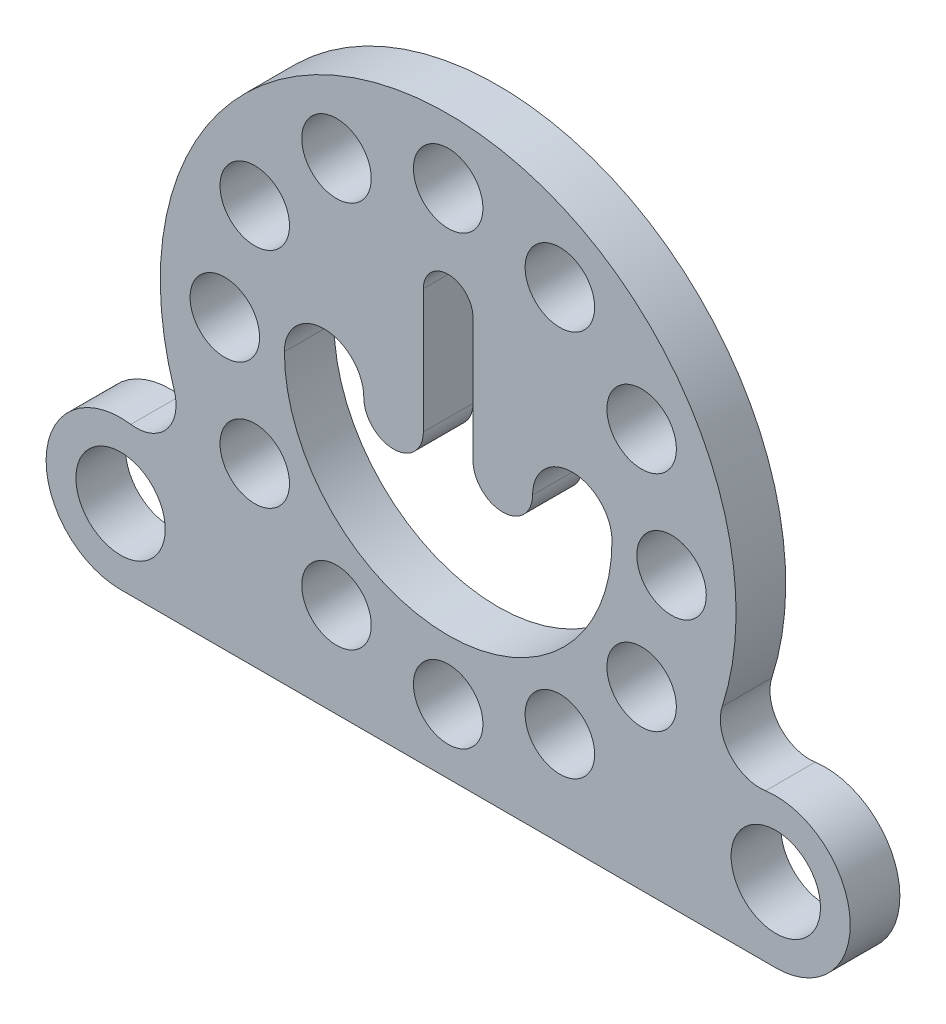
ISO-10303-21;
HEADER;
FILE_DESCRIPTION(('STEP AP214'),'2;1');
FILE_NAME('part.step','',(''),(''),'','','');
FILE_SCHEMA(('AUTOMOTIVE_DESIGN { 1 0 10303 214 1 1 1 1 }'));
ENDSEC;
DATA;
#1=APPLICATION_CONTEXT('core data for automotive mechanical design processes');
#2=APPLICATION_PROTOCOL_DEFINITION('international standard','automotive_design',2000,#1);
#3=PRODUCT_CONTEXT('',#1,'mechanical');
#4=PRODUCT('Part','Part','',(#3));
#5=PRODUCT_RELATED_PRODUCT_CATEGORY('part','',(#4));
#6=PRODUCT_DEFINITION_FORMATION('','',#4);
#7=PRODUCT_DEFINITION_CONTEXT('part definition',#1,'design');
#8=PRODUCT_DEFINITION('design','',#6,#7);
#9=PRODUCT_DEFINITION_SHAPE('','',#8);
#10=(LENGTH_UNIT() NAMED_UNIT(*) SI_UNIT(.MILLI.,.METRE.));
#11=(NAMED_UNIT(*) PLANE_ANGLE_UNIT() SI_UNIT($,.RADIAN.));
#12=(NAMED_UNIT(*) SI_UNIT($,.STERADIAN.) SOLID_ANGLE_UNIT());
#13=UNCERTAINTY_MEASURE_WITH_UNIT(LENGTH_MEASURE(1.E-05),#10,'distance_accuracy_value','');
#14=(GEOMETRIC_REPRESENTATION_CONTEXT(3) GLOBAL_UNCERTAINTY_ASSIGNED_CONTEXT((#13)) GLOBAL_UNIT_ASSIGNED_CONTEXT((#10,
#11,#12)) REPRESENTATION_CONTEXT('',''));
#15=CARTESIAN_POINT('',(0.,0.,0.));
#16=DIRECTION('',(0.,0.,1.));
#17=DIRECTION('',(1.,0.,0.));
#18=AXIS2_PLACEMENT_3D('',#15,#16,#17);
#19=CARTESIAN_POINT('',(5.,0.,10.));
#20=DIRECTION('',(1.,0.,0.));
#21=DIRECTION('',(0.,1.,0.));
#22=AXIS2_PLACEMENT_3D('',#19,#20,#21);
#23=PLANE('',#22);
#24=DIRECTION('',(0.,-1.,0.));
#25=VECTOR('',#24,1.);
#26=CARTESIAN_POINT('',(5.,0.,0.));
#27=LINE('',#26,#25);
#28=CARTESIAN_POINT('',(5.,25.,0.));
#29=VERTEX_POINT('',#28);
#30=CARTESIAN_POINT('',(5.,0.,0.));
#31=VERTEX_POINT('',#30);
#32=EDGE_CURVE('E235',#29,#31,#27,.T.);
#33=ORIENTED_EDGE('',*,*,#32,.T.);
#34=DIRECTION('',(0.,0.,-1.));
#35=VECTOR('',#34,1.);
#36=CARTESIAN_POINT('',(5.,0.,10.));
#37=LINE('',#36,#35);
#38=CARTESIAN_POINT('',(5.,0.,10.));
#39=VERTEX_POINT('',#38);
#40=EDGE_CURVE('E11',#39,#31,#37,.T.);
#41=ORIENTED_EDGE('',*,*,#40,.F.);
#42=DIRECTION('',(0.,-1.,0.));
#43=VECTOR('',#42,1.);
#44=CARTESIAN_POINT('',(5.,0.,10.));
#45=LINE('',#44,#43);
#46=CARTESIAN_POINT('',(5.,25.,10.));
#47=VERTEX_POINT('',#46);
#48=EDGE_CURVE('E379',#47,#39,#45,.T.);
#49=ORIENTED_EDGE('',*,*,#48,.F.);
#50=DIRECTION('',(0.,0.,-1.));
#51=VECTOR('',#50,1.);
#52=CARTESIAN_POINT('',(5.,25.,10.));
#53=LINE('',#52,#51);
#54=EDGE_CURVE('E55',#47,#29,#53,.T.);
#55=ORIENTED_EDGE('',*,*,#54,.T.);
#56=EDGE_LOOP('',(#33,#41,#49,#55));
#57=FACE_BOUND('',#56,.T.);
#58=ADVANCED_FACE('F36',(#57),#23,.F.);
#59=CARTESIAN_POINT('',(11.,0.,10.));
#60=DIRECTION('',(0.,0.,-1.));
#61=DIRECTION('',(-1.,0.,0.));
#62=AXIS2_PLACEMENT_3D('',#59,#60,#61);
#63=CYLINDRICAL_SURFACE('',#62,6.);
#64=CARTESIAN_POINT('',(11.,0.,0.));
#65=DIRECTION('',(0.,0.,1.));
#66=DIRECTION('',(1.,0.,0.));
#67=AXIS2_PLACEMENT_3D('',#64,#65,#66);
#68=CIRCLE('',#67,6.);
#69=CARTESIAN_POINT('',(17.,0.,0.));
#70=VERTEX_POINT('',#69);
#71=EDGE_CURVE('E237',#31,#70,#68,.T.);
#72=ORIENTED_EDGE('',*,*,#71,.T.);
#73=DIRECTION('',(0.,0.,-1.));
#74=VECTOR('',#73,1.);
#75=CARTESIAN_POINT('',(17.,0.,10.));
#76=LINE('',#75,#74);
#77=CARTESIAN_POINT('',(17.,0.,10.));
#78=VERTEX_POINT('',#77);
#79=EDGE_CURVE('E46',#78,#70,#76,.T.);
#80=ORIENTED_EDGE('',*,*,#79,.F.);
#81=CARTESIAN_POINT('',(11.,0.,10.));
#82=DIRECTION('',(0.,0.,1.));
#83=DIRECTION('',(1.,0.,0.));
#84=AXIS2_PLACEMENT_3D('',#81,#82,#83);
#85=CIRCLE('',#84,6.);
#86=EDGE_CURVE('E375',#39,#78,#85,.T.);
#87=ORIENTED_EDGE('',*,*,#86,.F.);
#88=ORIENTED_EDGE('',*,*,#40,.T.);
#89=EDGE_LOOP('',(#72,#80,#87,#88));
#90=FACE_BOUND('',#89,.T.);
#91=ADVANCED_FACE('F318',(#90),#63,.T.);
#92=CARTESIAN_POINT('',(25.,0.,10.));
#93=DIRECTION('',(0.,0.,-1.));
#94=DIRECTION('',(-1.,0.,0.));
#95=AXIS2_PLACEMENT_3D('',#92,#93,#94);
#96=CYLINDRICAL_SURFACE('',#95,8.);
#97=CARTESIAN_POINT('',(25.,0.,0.));
#98=DIRECTION('',(0.,0.,1.));
#99=DIRECTION('',(1.,0.,0.));
#100=AXIS2_PLACEMENT_3D('',#97,#98,#99);
#101=CIRCLE('',#100,8.);
#102=CARTESIAN_POINT('',(33.,0.,0.));
#103=VERTEX_POINT('',#102);
#104=EDGE_CURVE('E240',#103,#70,#101,.T.);
#105=ORIENTED_EDGE('',*,*,#104,.F.);
#106=DIRECTION('',(0.,0.,-1.));
#107=VECTOR('',#106,1.);
#108=CARTESIAN_POINT('',(33.,0.,10.));
#109=LINE('',#108,#107);
#110=CARTESIAN_POINT('',(33.,0.,10.));
#111=VERTEX_POINT('',#110);
#112=EDGE_CURVE('E267',#111,#103,#109,.T.);
#113=ORIENTED_EDGE('',*,*,#112,.F.);
#114=CARTESIAN_POINT('',(25.,0.,10.));
#115=DIRECTION('',(0.,0.,1.));
#116=DIRECTION('',(1.,0.,0.));
#117=AXIS2_PLACEMENT_3D('',#114,#115,#116);
#118=CIRCLE('',#117,8.);
#119=EDGE_CURVE('E373',#111,#78,#118,.T.);
#120=ORIENTED_EDGE('',*,*,#119,.T.);
#121=ORIENTED_EDGE('',*,*,#79,.T.);
#122=EDGE_LOOP('',(#105,#113,#120,#121));
#123=FACE_BOUND('',#122,.T.);
#124=ADVANCED_FACE('F323',(#123),#96,.F.);
#125=CARTESIAN_POINT('',(0.,0.,10.));
#126=DIRECTION('',(0.,0.,-1.));
#127=DIRECTION('',(-1.,0.,0.));
#128=AXIS2_PLACEMENT_3D('',#125,#126,#127);
#129=CYLINDRICAL_SURFACE('',#128,33.);
#130=CARTESIAN_POINT('',(0.,0.,0.));
#131=DIRECTION('',(0.,0.,1.));
#132=DIRECTION('',(1.,0.,0.));
#133=AXIS2_PLACEMENT_3D('',#130,#131,#132);
#134=CIRCLE('',#133,33.);
#135=CARTESIAN_POINT('',(-33.,0.,0.));
#136=VERTEX_POINT('',#135);
#137=EDGE_CURVE('E243',#136,#103,#134,.T.);
#138=ORIENTED_EDGE('',*,*,#137,.F.);
#139=DIRECTION('',(0.,0.,-1.));
#140=VECTOR('',#139,1.);
#141=CARTESIAN_POINT('',(-33.,0.,10.));
#142=LINE('',#141,#140);
#143=CARTESIAN_POINT('',(-33.,0.,10.));
#144=VERTEX_POINT('',#143);
#145=EDGE_CURVE('E265',#144,#136,#142,.T.);
#146=ORIENTED_EDGE('',*,*,#145,.F.);
#147=CARTESIAN_POINT('',(0.,0.,10.));
#148=DIRECTION('',(0.,0.,1.));
#149=DIRECTION('',(1.,0.,0.));
#150=AXIS2_PLACEMENT_3D('',#147,#148,#149);
#151=CIRCLE('',#150,33.);
#152=EDGE_CURVE('E372',#144,#111,#151,.T.);
#153=ORIENTED_EDGE('',*,*,#152,.T.);
#154=ORIENTED_EDGE('',*,*,#112,.T.);
#155=EDGE_LOOP('',(#138,#146,#153,#154));
#156=FACE_BOUND('',#155,.T.);
#157=ADVANCED_FACE('F356',(#156),#129,.F.);
#158=CARTESIAN_POINT('',(-25.,1.00710903625967E-13,10.));
#159=DIRECTION('',(0.,0.,-1.));
#160=DIRECTION('',(-1.,0.,0.));
#161=AXIS2_PLACEMENT_3D('',#158,#159,#160);
#162=CYLINDRICAL_SURFACE('',#161,8.);
#163=CARTESIAN_POINT('',(-25.,1.00710903625967E-13,0.));
#164=DIRECTION('',(0.,0.,1.));
#165=DIRECTION('',(1.,0.,0.));
#166=AXIS2_PLACEMENT_3D('',#163,#164,#165);
#167=CIRCLE('',#166,8.);
#168=CARTESIAN_POINT('',(-17.,1.00710903625967E-13,0.));
#169=VERTEX_POINT('',#168);
#170=EDGE_CURVE('E246',#169,#136,#167,.T.);
#171=ORIENTED_EDGE('',*,*,#170,.F.);
#172=DIRECTION('',(0.,0.,-1.));
#173=VECTOR('',#172,1.);
#174=CARTESIAN_POINT('',(-17.,1.00710903625967E-13,10.));
#175=LINE('',#174,#173);
#176=CARTESIAN_POINT('',(-17.,1.00710903625967E-13,10.));
#177=VERTEX_POINT('',#176);
#178=EDGE_CURVE('E167',#177,#169,#175,.T.);
#179=ORIENTED_EDGE('',*,*,#178,.F.);
#180=CARTESIAN_POINT('',(-25.,1.00710903625967E-13,10.));
#181=DIRECTION('',(0.,0.,1.));
#182=DIRECTION('',(1.,0.,0.));
#183=AXIS2_PLACEMENT_3D('',#180,#181,#182);
#184=CIRCLE('',#183,8.);
#185=EDGE_CURVE('E157',#177,#144,#184,.T.);
#186=ORIENTED_EDGE('',*,*,#185,.T.);
#187=ORIENTED_EDGE('',*,*,#145,.T.);
#188=EDGE_LOOP('',(#171,#179,#186,#187));
#189=FACE_BOUND('',#188,.T.);
#190=ADVANCED_FACE('F353',(#189),#162,.F.);
#191=CARTESIAN_POINT('',(-11.,0.,10.));
#192=DIRECTION('',(0.,0.,-1.));
#193=DIRECTION('',(-1.,0.,0.));
#194=AXIS2_PLACEMENT_3D('',#191,#192,#193);
#195=CYLINDRICAL_SURFACE('',#194,6.);
#196=CARTESIAN_POINT('',(-11.,0.,0.));
#197=DIRECTION('',(0.,0.,1.));
#198=DIRECTION('',(1.,0.,0.));
#199=AXIS2_PLACEMENT_3D('',#196,#197,#198);
#200=CIRCLE('',#199,6.);
#201=CARTESIAN_POINT('',(-5.,0.,0.));
#202=VERTEX_POINT('',#201);
#203=EDGE_CURVE('E164',#169,#202,#200,.T.);
#204=ORIENTED_EDGE('',*,*,#203,.T.);
#205=DIRECTION('',(0.,0.,-1.));
#206=VECTOR('',#205,1.);
#207=CARTESIAN_POINT('',(-5.,0.,10.));
#208=LINE('',#207,#206);
#209=CARTESIAN_POINT('',(-5.,0.,10.));
#210=VERTEX_POINT('',#209);
#211=EDGE_CURVE('E161',#210,#202,#208,.T.);
#212=ORIENTED_EDGE('',*,*,#211,.F.);
#213=CARTESIAN_POINT('',(-11.,0.,10.));
#214=DIRECTION('',(0.,0.,1.));
#215=DIRECTION('',(1.,0.,0.));
#216=AXIS2_PLACEMENT_3D('',#213,#214,#215);
#217=CIRCLE('',#216,6.);
#218=EDGE_CURVE('E147',#177,#210,#217,.T.);
#219=ORIENTED_EDGE('',*,*,#218,.F.);
#220=ORIENTED_EDGE('',*,*,#178,.T.);
#221=EDGE_LOOP('',(#204,#212,#219,#220));
#222=FACE_BOUND('',#221,.T.);
#223=ADVANCED_FACE('F162',(#222),#195,.T.);
#224=CARTESIAN_POINT('',(-5.,0.,10.));
#225=DIRECTION('',(1.,0.,0.));
#226=DIRECTION('',(0.,1.,0.));
#227=AXIS2_PLACEMENT_3D('',#224,#225,#226);
#228=PLANE('',#227);
#229=DIRECTION('',(0.,-1.,0.));
#230=VECTOR('',#229,1.);
#231=CARTESIAN_POINT('',(-5.,0.,0.));
#232=LINE('',#231,#230);
#233=CARTESIAN_POINT('',(-5.,25.,0.));
#234=VERTEX_POINT('',#233);
#235=EDGE_CURVE('E250',#234,#202,#232,.T.);
#236=ORIENTED_EDGE('',*,*,#235,.F.);
#237=DIRECTION('',(0.,0.,-1.));
#238=VECTOR('',#237,1.);
#239=CARTESIAN_POINT('',(-5.,25.,10.));
#240=LINE('',#239,#238);
#241=CARTESIAN_POINT('',(-5.,25.,10.));
#242=VERTEX_POINT('',#241);
#243=EDGE_CURVE('E99',#242,#234,#240,.T.);
#244=ORIENTED_EDGE('',*,*,#243,.F.);
#245=DIRECTION('',(0.,-1.,0.));
#246=VECTOR('',#245,1.);
#247=CARTESIAN_POINT('',(-5.,0.,10.));
#248=LINE('',#247,#246);
#249=EDGE_CURVE('E154',#242,#210,#248,.T.);
#250=ORIENTED_EDGE('',*,*,#249,.T.);
#251=ORIENTED_EDGE('',*,*,#211,.T.);
#252=EDGE_LOOP('',(#236,#244,#250,#251));
#253=FACE_BOUND('',#252,.T.);
#254=ADVANCED_FACE('F169',(#253),#228,.T.);
#255=CARTESIAN_POINT('',(0.,0.,10.));
#256=DIRECTION('',(0.,0.,-1.));
#257=DIRECTION('',(-1.,0.,0.));
#258=AXIS2_PLACEMENT_3D('',#255,#256,#257);
#259=CYLINDRICAL_SURFACE('',#258,58.);
#260=CARTESIAN_POINT('',(0.,0.,0.));
#261=DIRECTION('',(0.,0.,1.));
#262=DIRECTION('',(1.,0.,0.));
#263=AXIS2_PLACEMENT_3D('',#260,#261,#262);
#264=CIRCLE('',#263,58.);
#265=CARTESIAN_POINT('',(55.2110417489052,-17.7690987109827,0.));
#266=VERTEX_POINT('',#265);
#267=CARTESIAN_POINT('',(-55.2110417489052,-17.7690987109828,0.));
#268=VERTEX_POINT('',#267);
#269=EDGE_CURVE('E218',#266,#268,#264,.T.);
#270=ORIENTED_EDGE('',*,*,#269,.T.);
#271=DIRECTION('',(0.,0.,-1.));
#272=VECTOR('',#271,1.);
#273=CARTESIAN_POINT('',(-55.2110417489052,-17.7690987109828,10.));
#274=LINE('',#273,#272);
#275=CARTESIAN_POINT('',(-55.2110417489052,-17.7690987109828,10.));
#276=VERTEX_POINT('',#275);
#277=EDGE_CURVE('E40',#276,#268,#274,.T.);
#278=ORIENTED_EDGE('',*,*,#277,.F.);
#279=CARTESIAN_POINT('',(0.,0.,10.));
#280=DIRECTION('',(0.,0.,1.));
#281=DIRECTION('',(1.,0.,0.));
#282=AXIS2_PLACEMENT_3D('',#279,#280,#281);
#283=CIRCLE('',#282,58.);
#284=CARTESIAN_POINT('',(55.2110417489052,-17.7690987109827,10.));
#285=VERTEX_POINT('',#284);
#286=EDGE_CURVE('E388',#285,#276,#283,.T.);
#287=ORIENTED_EDGE('',*,*,#286,.F.);
#288=DIRECTION('',(0.,0.,-1.));
#289=VECTOR('',#288,1.);
#290=CARTESIAN_POINT('',(55.2110417489052,-17.7690987109827,10.));
#291=LINE('',#290,#289);
#292=EDGE_CURVE('E181',#285,#266,#291,.T.);
#293=ORIENTED_EDGE('',*,*,#292,.T.);
#294=EDGE_LOOP('',(#270,#278,#287,#293));
#295=FACE_BOUND('',#294,.T.);
#296=ADVANCED_FACE('F286',(#295),#259,.T.);
#297=CARTESIAN_POINT('',(-62.8263578522024,-20.2200088780149,10.));
#298=DIRECTION('',(0.,0.,-1.));
#299=DIRECTION('',(-1.,0.,0.));
#300=AXIS2_PLACEMENT_3D('',#297,#298,#299);
#301=CYLINDRICAL_SURFACE('',#300,7.99999999999999);
#302=CARTESIAN_POINT('',(-62.8263578522024,-20.2200088780149,0.));
#303=DIRECTION('',(0.,0.,1.));
#304=DIRECTION('',(1.,0.,0.));
#305=AXIS2_PLACEMENT_3D('',#302,#303,#304);
#306=CIRCLE('',#305,7.99999999999999);
#307=CARTESIAN_POINT('',(-63.9302333818712,-28.1434840508793,0.));
#308=VERTEX_POINT('',#307);
#309=EDGE_CURVE('E221',#268,#308,#306,.F.);
#310=ORIENTED_EDGE('',*,*,#309,.T.);
#311=DIRECTION('',(0.,0.,-1.));
#312=VECTOR('',#311,1.);
#313=CARTESIAN_POINT('',(-63.9302333818712,-28.1434840508793,10.));
#314=LINE('',#313,#312);
#315=CARTESIAN_POINT('',(-63.9302333818712,-28.1434840508793,10.));
#316=VERTEX_POINT('',#315);
#317=EDGE_CURVE('E276',#316,#308,#314,.T.);
#318=ORIENTED_EDGE('',*,*,#317,.F.);
#319=CARTESIAN_POINT('',(-62.8263578522024,-20.2200088780149,10.));
#320=DIRECTION('',(0.,0.,1.));
#321=DIRECTION('',(1.,0.,0.));
#322=AXIS2_PLACEMENT_3D('',#319,#320,#321);
#323=CIRCLE('',#322,7.99999999999999);
#324=EDGE_CURVE('E112',#276,#316,#323,.F.);
#325=ORIENTED_EDGE('',*,*,#324,.F.);
#326=ORIENTED_EDGE('',*,*,#277,.T.);
#327=EDGE_LOOP('',(#310,#318,#325,#326));
#328=FACE_BOUND('',#327,.T.);
#329=ADVANCED_FACE('F282',(#328),#301,.F.);
#330=CARTESIAN_POINT('',(-66.,-43.,10.));
#331=DIRECTION('',(0.,0.,-1.));
#332=DIRECTION('',(-1.,0.,0.));
#333=AXIS2_PLACEMENT_3D('',#330,#331,#332);
#334=CYLINDRICAL_SURFACE('',#333,15.);
#335=CARTESIAN_POINT('',(-66.,-43.,0.));
#336=DIRECTION('',(0.,0.,1.));
#337=DIRECTION('',(1.,0.,0.));
#338=AXIS2_PLACEMENT_3D('',#335,#336,#337);
#339=CIRCLE('',#338,15.);
#340=CARTESIAN_POINT('',(-66.,-58.,0.));
#341=VERTEX_POINT('',#340);
#342=EDGE_CURVE('E223',#308,#341,#339,.T.);
#343=ORIENTED_EDGE('',*,*,#342,.T.);
#344=DIRECTION('',(0.,0.,-1.));
#345=VECTOR('',#344,1.);
#346=CARTESIAN_POINT('',(-66.,-58.,10.));
#347=LINE('',#346,#345);
#348=CARTESIAN_POINT('',(-66.,-58.,10.));
#349=VERTEX_POINT('',#348);
#350=EDGE_CURVE('E275',#349,#341,#347,.T.);
#351=ORIENTED_EDGE('',*,*,#350,.F.);
#352=CARTESIAN_POINT('',(-66.,-43.,10.));
#353=DIRECTION('',(0.,0.,1.));
#354=DIRECTION('',(1.,0.,0.));
#355=AXIS2_PLACEMENT_3D('',#352,#353,#354);
#356=CIRCLE('',#355,15.);
#357=EDGE_CURVE('E385',#316,#349,#356,.T.);
#358=ORIENTED_EDGE('',*,*,#357,.F.);
#359=ORIENTED_EDGE('',*,*,#317,.T.);
#360=EDGE_LOOP('',(#343,#351,#358,#359));
#361=FACE_BOUND('',#360,.T.);
#362=ADVANCED_FACE('F308',(#361),#334,.T.);
#363=CARTESIAN_POINT('',(0.,-58.,10.));
#364=DIRECTION('',(0.,-1.,0.));
#365=DIRECTION('',(1.,0.,0.));
#366=AXIS2_PLACEMENT_3D('',#363,#364,#365);
#367=PLANE('',#366);
#368=DIRECTION('',(-1.,0.,0.));
#369=VECTOR('',#368,1.);
#370=CARTESIAN_POINT('',(0.,-58.,0.));
#371=LINE('',#370,#369);
#372=CARTESIAN_POINT('',(66.,-58.,0.));
#373=VERTEX_POINT('',#372);
#374=EDGE_CURVE('E226',#373,#341,#371,.T.);
#375=ORIENTED_EDGE('',*,*,#374,.F.);
#376=DIRECTION('',(0.,0.,-1.));
#377=VECTOR('',#376,1.);
#378=CARTESIAN_POINT('',(66.,-58.,10.));
#379=LINE('',#378,#377);
#380=CARTESIAN_POINT('',(66.,-58.,10.));
#381=VERTEX_POINT('',#380);
#382=EDGE_CURVE('E273',#381,#373,#379,.T.);
#383=ORIENTED_EDGE('',*,*,#382,.F.);
#384=DIRECTION('',(-1.,0.,0.));
#385=VECTOR('',#384,1.);
#386=CARTESIAN_POINT('',(0.,-58.,10.));
#387=LINE('',#386,#385);
#388=EDGE_CURVE('E307',#381,#349,#387,.T.);
#389=ORIENTED_EDGE('',*,*,#388,.T.);
#390=ORIENTED_EDGE('',*,*,#350,.T.);
#391=EDGE_LOOP('',(#375,#383,#389,#390));
#392=FACE_BOUND('',#391,.T.);
#393=ADVANCED_FACE('F303',(#392),#367,.T.);
#394=CARTESIAN_POINT('',(66.,-43.,10.));
#395=DIRECTION('',(0.,0.,-1.));
#396=DIRECTION('',(-1.,0.,0.));
#397=AXIS2_PLACEMENT_3D('',#394,#395,#396);
#398=CYLINDRICAL_SURFACE('',#397,15.);
#399=CARTESIAN_POINT('',(66.,-43.,0.));
#400=DIRECTION('',(0.,0.,1.));
#401=DIRECTION('',(1.,0.,0.));
#402=AXIS2_PLACEMENT_3D('',#399,#400,#401);
#403=CIRCLE('',#402,15.);
#404=CARTESIAN_POINT('',(63.9302333818712,-28.1434840508792,0.));
#405=VERTEX_POINT('',#404);
#406=EDGE_CURVE('E229',#405,#373,#403,.F.);
#407=ORIENTED_EDGE('',*,*,#406,.F.);
#408=DIRECTION('',(0.,0.,-1.));
#409=VECTOR('',#408,1.);
#410=CARTESIAN_POINT('',(63.9302333818712,-28.1434840508792,10.));
#411=LINE('',#410,#409);
#412=CARTESIAN_POINT('',(63.9302333818712,-28.1434840508792,10.));
#413=VERTEX_POINT('',#412);
#414=EDGE_CURVE('E271',#413,#405,#411,.T.);
#415=ORIENTED_EDGE('',*,*,#414,.F.);
#416=CARTESIAN_POINT('',(66.,-43.,10.));
#417=DIRECTION('',(0.,0.,1.));
#418=DIRECTION('',(1.,0.,0.));
#419=AXIS2_PLACEMENT_3D('',#416,#417,#418);
#420=CIRCLE('',#419,15.);
#421=EDGE_CURVE('E382',#413,#381,#420,.F.);
#422=ORIENTED_EDGE('',*,*,#421,.T.);
#423=ORIENTED_EDGE('',*,*,#382,.T.);
#424=EDGE_LOOP('',(#407,#415,#422,#423));
#425=FACE_BOUND('',#424,.T.);
#426=ADVANCED_FACE('F300',(#425),#398,.T.);
#427=CARTESIAN_POINT('',(66.,-43.,10.));
#428=DIRECTION('',(0.,0.,-1.));
#429=DIRECTION('',(-1.,0.,0.));
#430=AXIS2_PLACEMENT_3D('',#427,#428,#429);
#431=CYLINDRICAL_SURFACE('',#430,9.);
#432=CARTESIAN_POINT('',(66.,-43.,10.));
#433=DIRECTION('',(0.,0.,1.));
#434=DIRECTION('',(1.,0.,0.));
#435=AXIS2_PLACEMENT_3D('',#432,#433,#434);
#436=CIRCLE('',#435,9.);
#437=CARTESIAN_POINT('',(75.,-43.,10.));
#438=VERTEX_POINT('',#437);
#439=EDGE_CURVE('E172',#438,#438,#436,.F.);
#440=ORIENTED_EDGE('',*,*,#439,.F.);
#441=EDGE_LOOP('',(#440));
#442=FACE_BOUND('',#441,.T.);
#443=CARTESIAN_POINT('',(66.,-43.,0.));
#444=DIRECTION('',(0.,0.,1.));
#445=DIRECTION('',(1.,0.,0.));
#446=AXIS2_PLACEMENT_3D('',#443,#444,#445);
#447=CIRCLE('',#446,9.);
#448=CARTESIAN_POINT('',(75.,-43.,0.));
#449=VERTEX_POINT('',#448);
#450=EDGE_CURVE('E255',#449,#449,#447,.F.);
#451=ORIENTED_EDGE('',*,*,#450,.T.);
#452=EDGE_LOOP('',(#451));
#453=FACE_BOUND('',#452,.T.);
#454=ADVANCED_FACE('F333',(#442,#453),#431,.F.);
#455=CARTESIAN_POINT('',(0.,25.,10.));
#456=DIRECTION('',(0.,0.,-1.));
#457=DIRECTION('',(-1.,0.,0.));
#458=AXIS2_PLACEMENT_3D('',#455,#456,#457);
#459=CYLINDRICAL_SURFACE('',#458,5.);
#460=CARTESIAN_POINT('',(0.,25.,0.));
#461=DIRECTION('',(0.,0.,1.));
#462=DIRECTION('',(1.,0.,0.));
#463=AXIS2_PLACEMENT_3D('',#460,#461,#462);
#464=CIRCLE('',#463,5.);
#465=EDGE_CURVE('E252',#29,#234,#464,.T.);
#466=ORIENTED_EDGE('',*,*,#465,.F.);
#467=ORIENTED_EDGE('',*,*,#54,.F.);
#468=CARTESIAN_POINT('',(0.,25.,10.));
#469=DIRECTION('',(0.,0.,1.));
#470=DIRECTION('',(1.,0.,0.));
#471=AXIS2_PLACEMENT_3D('',#468,#469,#470);
#472=CIRCLE('',#471,5.);
#473=EDGE_CURVE('E170',#47,#242,#472,.T.);
#474=ORIENTED_EDGE('',*,*,#473,.T.);
#475=ORIENTED_EDGE('',*,*,#243,.T.);
#476=EDGE_LOOP('',(#466,#467,#474,#475));
#477=FACE_BOUND('',#476,.T.);
#478=ADVANCED_FACE('F331',(#477),#459,.F.);
#479=CARTESIAN_POINT('',(62.8263578522024,-20.2200088780148,10.));
#480=DIRECTION('',(0.,0.,-1.));
#481=DIRECTION('',(-1.,0.,0.));
#482=AXIS2_PLACEMENT_3D('',#479,#480,#481);
#483=CYLINDRICAL_SURFACE('',#482,7.99999999999999);
#484=CARTESIAN_POINT('',(62.8263578522024,-20.2200088780148,0.));
#485=DIRECTION('',(0.,0.,1.));
#486=DIRECTION('',(1.,0.,0.));
#487=AXIS2_PLACEMENT_3D('',#484,#485,#486);
#488=CIRCLE('',#487,7.99999999999999);
#489=EDGE_CURVE('E232',#266,#405,#488,.T.);
#490=ORIENTED_EDGE('',*,*,#489,.F.);
#491=ORIENTED_EDGE('',*,*,#292,.F.);
#492=CARTESIAN_POINT('',(62.8263578522024,-20.2200088780148,10.));
#493=DIRECTION('',(0.,0.,1.));
#494=DIRECTION('',(1.,0.,0.));
#495=AXIS2_PLACEMENT_3D('',#492,#493,#494);
#496=CIRCLE('',#495,7.99999999999999);
#497=EDGE_CURVE('E296',#285,#413,#496,.T.);
#498=ORIENTED_EDGE('',*,*,#497,.T.);
#499=ORIENTED_EDGE('',*,*,#414,.T.);
#500=EDGE_LOOP('',(#490,#491,#498,#499));
#501=FACE_BOUND('',#500,.T.);
#502=ADVANCED_FACE('F292',(#501),#483,.F.);
#503=CARTESIAN_POINT('',(0.,45.,10.));
#504=DIRECTION('',(0.,0.,-1.));
#505=DIRECTION('',(-1.,0.,0.));
#506=AXIS2_PLACEMENT_3D('',#503,#504,#505);
#507=CYLINDRICAL_SURFACE('',#506,7.);
#508=CARTESIAN_POINT('',(0.,45.,10.));
#509=DIRECTION('',(0.,0.,1.));
#510=DIRECTION('',(1.,0.,0.));
#511=AXIS2_PLACEMENT_3D('',#508,#509,#510);
#512=CIRCLE('',#511,7.);
#513=CARTESIAN_POINT('',(7.,45.,10.));
#514=VERTEX_POINT('',#513);
#515=EDGE_CURVE('E390',#514,#514,#512,.T.);
#516=ORIENTED_EDGE('',*,*,#515,.T.);
#517=EDGE_LOOP('',(#516));
#518=FACE_BOUND('',#517,.T.);
#519=CARTESIAN_POINT('',(0.,45.,0.));
#520=DIRECTION('',(0.,0.,1.));
#521=DIRECTION('',(1.,0.,0.));
#522=AXIS2_PLACEMENT_3D('',#519,#520,#521);
#523=CIRCLE('',#522,7.);
#524=CARTESIAN_POINT('',(7.,45.,0.));
#525=VERTEX_POINT('',#524);
#526=EDGE_CURVE('E215',#525,#525,#523,.T.);
#527=ORIENTED_EDGE('',*,*,#526,.F.);
#528=EDGE_LOOP('',(#527));
#529=FACE_BOUND('',#528,.T.);
#530=ADVANCED_FACE('F330',(#518,#529),#507,.F.);
#531=CARTESIAN_POINT('',(22.5,38.9711431702997,10.));
#532=DIRECTION('',(0.,0.,-1.));
#533=DIRECTION('',(-1.,0.,0.));
#534=AXIS2_PLACEMENT_3D('',#531,#532,#533);
#535=CYLINDRICAL_SURFACE('',#534,7.);
#536=CARTESIAN_POINT('',(22.5,38.9711431702997,10.));
#537=DIRECTION('',(0.,0.,1.));
#538=DIRECTION('',(1.,0.,0.));
#539=AXIS2_PLACEMENT_3D('',#536,#537,#538);
#540=CIRCLE('',#539,7.);
#541=CARTESIAN_POINT('',(29.5,38.9711431702997,10.));
#542=VERTEX_POINT('',#541);
#543=EDGE_CURVE('E393',#542,#542,#540,.T.);
#544=ORIENTED_EDGE('',*,*,#543,.T.);
#545=EDGE_LOOP('',(#544));
#546=FACE_BOUND('',#545,.T.);
#547=CARTESIAN_POINT('',(22.5,38.9711431702997,0.));
#548=DIRECTION('',(0.,0.,1.));
#549=DIRECTION('',(1.,0.,0.));
#550=AXIS2_PLACEMENT_3D('',#547,#548,#549);
#551=CIRCLE('',#550,7.);
#552=CARTESIAN_POINT('',(29.5,38.9711431702997,0.));
#553=VERTEX_POINT('',#552);
#554=EDGE_CURVE('E212',#553,#553,#551,.T.);
#555=ORIENTED_EDGE('',*,*,#554,.F.);
#556=EDGE_LOOP('',(#555));
#557=FACE_BOUND('',#556,.T.);
#558=ADVANCED_FACE('F456',(#546,#557),#535,.F.);
#559=CARTESIAN_POINT('',(38.9711431703004,22.5000000000011,10.));
#560=DIRECTION('',(0.,0.,-1.));
#561=DIRECTION('',(-1.,0.,0.));
#562=AXIS2_PLACEMENT_3D('',#559,#560,#561);
#563=CYLINDRICAL_SURFACE('',#562,7.00000000000039);
#564=CARTESIAN_POINT('',(38.9711431703004,22.5000000000011,10.));
#565=DIRECTION('',(0.,0.,1.));
#566=DIRECTION('',(1.,0.,0.));
#567=AXIS2_PLACEMENT_3D('',#564,#565,#566);
#568=CIRCLE('',#567,7.00000000000039);
#569=CARTESIAN_POINT('',(45.9711431703008,22.5000000000011,10.));
#570=VERTEX_POINT('',#569);
#571=EDGE_CURVE('E396',#570,#570,#568,.T.);
#572=ORIENTED_EDGE('',*,*,#571,.T.);
#573=EDGE_LOOP('',(#572));
#574=FACE_BOUND('',#573,.T.);
#575=CARTESIAN_POINT('',(38.9711431703004,22.5000000000011,0.));
#576=DIRECTION('',(0.,0.,1.));
#577=DIRECTION('',(1.,0.,0.));
#578=AXIS2_PLACEMENT_3D('',#575,#576,#577);
#579=CIRCLE('',#578,7.00000000000039);
#580=CARTESIAN_POINT('',(45.9711431703008,22.5000000000011,0.));
#581=VERTEX_POINT('',#580);
#582=EDGE_CURVE('E209',#581,#581,#579,.T.);
#583=ORIENTED_EDGE('',*,*,#582,.F.);
#584=EDGE_LOOP('',(#583));
#585=FACE_BOUND('',#584,.T.);
#586=ADVANCED_FACE('F487',(#574,#585),#563,.F.);
#587=CARTESIAN_POINT('',(45.,0.,10.));
#588=DIRECTION('',(0.,0.,-1.));
#589=DIRECTION('',(-1.,0.,0.));
#590=AXIS2_PLACEMENT_3D('',#587,#588,#589);
#591=CYLINDRICAL_SURFACE('',#590,7.00000000000014);
#592=CARTESIAN_POINT('',(45.,0.,10.));
#593=DIRECTION('',(0.,0.,1.));
#594=DIRECTION('',(1.,0.,0.));
#595=AXIS2_PLACEMENT_3D('',#592,#593,#594);
#596=CIRCLE('',#595,7.00000000000014);
#597=CARTESIAN_POINT('',(52.0000000000001,0.,10.));
#598=VERTEX_POINT('',#597);
#599=EDGE_CURVE('E399',#598,#598,#596,.T.);
#600=ORIENTED_EDGE('',*,*,#599,.T.);
#601=EDGE_LOOP('',(#600));
#602=FACE_BOUND('',#601,.T.);
#603=CARTESIAN_POINT('',(45.,0.,0.));
#604=DIRECTION('',(0.,0.,1.));
#605=DIRECTION('',(1.,0.,0.));
#606=AXIS2_PLACEMENT_3D('',#603,#604,#605);
#607=CIRCLE('',#606,7.00000000000014);
#608=CARTESIAN_POINT('',(52.0000000000001,0.,0.));
#609=VERTEX_POINT('',#608);
#610=EDGE_CURVE('E206',#609,#609,#607,.T.);
#611=ORIENTED_EDGE('',*,*,#610,.F.);
#612=EDGE_LOOP('',(#611));
#613=FACE_BOUND('',#612,.T.);
#614=ADVANCED_FACE('F493',(#602,#613),#591,.F.);
#615=CARTESIAN_POINT('',(38.9711431702997,-22.5,10.));
#616=DIRECTION('',(0.,0.,-1.));
#617=DIRECTION('',(-1.,0.,0.));
#618=AXIS2_PLACEMENT_3D('',#615,#616,#617);
#619=CYLINDRICAL_SURFACE('',#618,7.0000000000002);
#620=CARTESIAN_POINT('',(38.9711431702997,-22.5,10.));
#621=DIRECTION('',(0.,0.,1.));
#622=DIRECTION('',(1.,0.,0.));
#623=AXIS2_PLACEMENT_3D('',#620,#621,#622);
#624=CIRCLE('',#623,7.0000000000002);
#625=CARTESIAN_POINT('',(45.9711431702999,-22.5,10.));
#626=VERTEX_POINT('',#625);
#627=EDGE_CURVE('E402',#626,#626,#624,.T.);
#628=ORIENTED_EDGE('',*,*,#627,.T.);
#629=EDGE_LOOP('',(#628));
#630=FACE_BOUND('',#629,.T.);
#631=CARTESIAN_POINT('',(38.9711431702997,-22.5,0.));
#632=DIRECTION('',(0.,0.,1.));
#633=DIRECTION('',(1.,0.,0.));
#634=AXIS2_PLACEMENT_3D('',#631,#632,#633);
#635=CIRCLE('',#634,7.0000000000002);
#636=CARTESIAN_POINT('',(45.9711431702999,-22.5,0.));
#637=VERTEX_POINT('',#636);
#638=EDGE_CURVE('E203',#637,#637,#635,.T.);
#639=ORIENTED_EDGE('',*,*,#638,.F.);
#640=EDGE_LOOP('',(#639));
#641=FACE_BOUND('',#640,.T.);
#642=ADVANCED_FACE('F500',(#630,#641),#619,.F.);
#643=CARTESIAN_POINT('',(22.5,-38.9711431702997,10.));
#644=DIRECTION('',(0.,0.,-1.));
#645=DIRECTION('',(-1.,0.,0.));
#646=AXIS2_PLACEMENT_3D('',#643,#644,#645);
#647=CYLINDRICAL_SURFACE('',#646,7.00000000000027);
#648=CARTESIAN_POINT('',(22.5,-38.9711431702997,10.));
#649=DIRECTION('',(0.,0.,1.));
#650=DIRECTION('',(1.,0.,0.));
#651=AXIS2_PLACEMENT_3D('',#648,#649,#650);
#652=CIRCLE('',#651,7.00000000000027);
#653=CARTESIAN_POINT('',(29.5000000000003,-38.9711431702997,10.));
#654=VERTEX_POINT('',#653);
#655=EDGE_CURVE('E405',#654,#654,#652,.T.);
#656=ORIENTED_EDGE('',*,*,#655,.T.);
#657=EDGE_LOOP('',(#656));
#658=FACE_BOUND('',#657,.T.);
#659=CARTESIAN_POINT('',(22.5,-38.9711431702997,0.));
#660=DIRECTION('',(0.,0.,1.));
#661=DIRECTION('',(1.,0.,0.));
#662=AXIS2_PLACEMENT_3D('',#659,#660,#661);
#663=CIRCLE('',#662,7.00000000000027);
#664=CARTESIAN_POINT('',(29.5000000000003,-38.9711431702997,0.));
#665=VERTEX_POINT('',#664);
#666=EDGE_CURVE('E200',#665,#665,#663,.T.);
#667=ORIENTED_EDGE('',*,*,#666,.F.);
#668=EDGE_LOOP('',(#667));
#669=FACE_BOUND('',#668,.T.);
#670=ADVANCED_FACE('F504',(#658,#669),#647,.F.);
#671=CARTESIAN_POINT('',(0.,-45.,10.));
#672=DIRECTION('',(0.,0.,-1.));
#673=DIRECTION('',(-1.,0.,0.));
#674=AXIS2_PLACEMENT_3D('',#671,#672,#673);
#675=CYLINDRICAL_SURFACE('',#674,7.00000000000031);
#676=CARTESIAN_POINT('',(0.,-45.,10.));
#677=DIRECTION('',(0.,0.,1.));
#678=DIRECTION('',(1.,0.,0.));
#679=AXIS2_PLACEMENT_3D('',#676,#677,#678);
#680=CIRCLE('',#679,7.00000000000031);
#681=CARTESIAN_POINT('',(7.00000000000031,-45.,10.));
#682=VERTEX_POINT('',#681);
#683=EDGE_CURVE('E408',#682,#682,#680,.T.);
#684=ORIENTED_EDGE('',*,*,#683,.T.);
#685=EDGE_LOOP('',(#684));
#686=FACE_BOUND('',#685,.T.);
#687=CARTESIAN_POINT('',(0.,-45.,0.));
#688=DIRECTION('',(0.,0.,1.));
#689=DIRECTION('',(1.,0.,0.));
#690=AXIS2_PLACEMENT_3D('',#687,#688,#689);
#691=CIRCLE('',#690,7.00000000000031);
#692=CARTESIAN_POINT('',(7.00000000000031,-45.,0.));
#693=VERTEX_POINT('',#692);
#694=EDGE_CURVE('E197',#693,#693,#691,.T.);
#695=ORIENTED_EDGE('',*,*,#694,.F.);
#696=EDGE_LOOP('',(#695));
#697=FACE_BOUND('',#696,.T.);
#698=ADVANCED_FACE('F508',(#686,#697),#675,.F.);
#699=CARTESIAN_POINT('',(-22.5,-38.9711431702997,10.));
#700=DIRECTION('',(0.,0.,-1.));
#701=DIRECTION('',(-1.,0.,0.));
#702=AXIS2_PLACEMENT_3D('',#699,#700,#701);
#703=CYLINDRICAL_SURFACE('',#702,7.00000000000036);
#704=CARTESIAN_POINT('',(-22.5,-38.9711431702997,10.));
#705=DIRECTION('',(0.,0.,1.));
#706=DIRECTION('',(1.,0.,0.));
#707=AXIS2_PLACEMENT_3D('',#704,#705,#706);
#708=CIRCLE('',#707,7.00000000000036);
#709=CARTESIAN_POINT('',(-15.4999999999996,-38.9711431702997,10.));
#710=VERTEX_POINT('',#709);
#711=EDGE_CURVE('E411',#710,#710,#708,.T.);
#712=ORIENTED_EDGE('',*,*,#711,.T.);
#713=EDGE_LOOP('',(#712));
#714=FACE_BOUND('',#713,.T.);
#715=CARTESIAN_POINT('',(-22.5,-38.9711431702997,0.));
#716=DIRECTION('',(0.,0.,1.));
#717=DIRECTION('',(1.,0.,0.));
#718=AXIS2_PLACEMENT_3D('',#715,#716,#717);
#719=CIRCLE('',#718,7.00000000000036);
#720=CARTESIAN_POINT('',(-15.4999999999996,-38.9711431702997,0.));
#721=VERTEX_POINT('',#720);
#722=EDGE_CURVE('E194',#721,#721,#719,.T.);
#723=ORIENTED_EDGE('',*,*,#722,.F.);
#724=EDGE_LOOP('',(#723));
#725=FACE_BOUND('',#724,.T.);
#726=ADVANCED_FACE('F512',(#714,#725),#703,.F.);
#727=CARTESIAN_POINT('',(-38.9711431702997,-22.5,10.));
#728=DIRECTION('',(0.,0.,-1.));
#729=DIRECTION('',(-1.,0.,0.));
#730=AXIS2_PLACEMENT_3D('',#727,#728,#729);
#731=CYLINDRICAL_SURFACE('',#730,7.00000000000042);
#732=CARTESIAN_POINT('',(-38.9711431702997,-22.5,10.));
#733=DIRECTION('',(0.,0.,1.));
#734=DIRECTION('',(1.,0.,0.));
#735=AXIS2_PLACEMENT_3D('',#732,#733,#734);
#736=CIRCLE('',#735,7.00000000000042);
#737=CARTESIAN_POINT('',(-31.9711431702993,-22.5,10.));
#738=VERTEX_POINT('',#737);
#739=EDGE_CURVE('E414',#738,#738,#736,.T.);
#740=ORIENTED_EDGE('',*,*,#739,.T.);
#741=EDGE_LOOP('',(#740));
#742=FACE_BOUND('',#741,.T.);
#743=CARTESIAN_POINT('',(-38.9711431702997,-22.5,0.));
#744=DIRECTION('',(0.,0.,1.));
#745=DIRECTION('',(1.,0.,0.));
#746=AXIS2_PLACEMENT_3D('',#743,#744,#745);
#747=CIRCLE('',#746,7.00000000000042);
#748=CARTESIAN_POINT('',(-31.9711431702993,-22.5,0.));
#749=VERTEX_POINT('',#748);
#750=EDGE_CURVE('E191',#749,#749,#747,.T.);
#751=ORIENTED_EDGE('',*,*,#750,.F.);
#752=EDGE_LOOP('',(#751));
#753=FACE_BOUND('',#752,.T.);
#754=ADVANCED_FACE('F516',(#742,#753),#731,.F.);
#755=CARTESIAN_POINT('',(-45.,0.,10.));
#756=DIRECTION('',(0.,0.,-1.));
#757=DIRECTION('',(-1.,0.,0.));
#758=AXIS2_PLACEMENT_3D('',#755,#756,#757);
#759=CYLINDRICAL_SURFACE('',#758,7.00000000000045);
#760=CARTESIAN_POINT('',(-45.,0.,10.));
#761=DIRECTION('',(0.,0.,1.));
#762=DIRECTION('',(1.,0.,0.));
#763=AXIS2_PLACEMENT_3D('',#760,#761,#762);
#764=CIRCLE('',#763,7.00000000000045);
#765=CARTESIAN_POINT('',(-37.9999999999996,0.,10.));
#766=VERTEX_POINT('',#765);
#767=EDGE_CURVE('E417',#766,#766,#764,.T.);
#768=ORIENTED_EDGE('',*,*,#767,.T.);
#769=EDGE_LOOP('',(#768));
#770=FACE_BOUND('',#769,.T.);
#771=CARTESIAN_POINT('',(-45.,0.,0.));
#772=DIRECTION('',(0.,0.,1.));
#773=DIRECTION('',(1.,0.,0.));
#774=AXIS2_PLACEMENT_3D('',#771,#772,#773);
#775=CIRCLE('',#774,7.00000000000045);
#776=CARTESIAN_POINT('',(-37.9999999999996,0.,0.));
#777=VERTEX_POINT('',#776);
#778=EDGE_CURVE('E188',#777,#777,#775,.T.);
#779=ORIENTED_EDGE('',*,*,#778,.F.);
#780=EDGE_LOOP('',(#779));
#781=FACE_BOUND('',#780,.T.);
#782=ADVANCED_FACE('F520',(#770,#781),#759,.F.);
#783=CARTESIAN_POINT('',(-38.9711431702991,22.4999999999989,10.));
#784=DIRECTION('',(0.,0.,-1.));
#785=DIRECTION('',(-1.,0.,0.));
#786=AXIS2_PLACEMENT_3D('',#783,#784,#785);
#787=CYLINDRICAL_SURFACE('',#786,7.00000000000147);
#788=CARTESIAN_POINT('',(-38.9711431702991,22.4999999999989,10.));
#789=DIRECTION('',(0.,0.,1.));
#790=DIRECTION('',(1.,0.,0.));
#791=AXIS2_PLACEMENT_3D('',#788,#789,#790);
#792=CIRCLE('',#791,7.00000000000147);
#793=CARTESIAN_POINT('',(-31.9711431702977,22.4999999999989,10.));
#794=VERTEX_POINT('',#793);
#795=EDGE_CURVE('E420',#794,#794,#792,.T.);
#796=ORIENTED_EDGE('',*,*,#795,.T.);
#797=EDGE_LOOP('',(#796));
#798=FACE_BOUND('',#797,.T.);
#799=CARTESIAN_POINT('',(-38.9711431702991,22.4999999999989,0.));
#800=DIRECTION('',(0.,0.,1.));
#801=DIRECTION('',(1.,0.,0.));
#802=AXIS2_PLACEMENT_3D('',#799,#800,#801);
#803=CIRCLE('',#802,7.00000000000147);
#804=CARTESIAN_POINT('',(-31.9711431702977,22.4999999999989,0.));
#805=VERTEX_POINT('',#804);
#806=EDGE_CURVE('E185',#805,#805,#803,.T.);
#807=ORIENTED_EDGE('',*,*,#806,.F.);
#808=EDGE_LOOP('',(#807));
#809=FACE_BOUND('',#808,.T.);
#810=ADVANCED_FACE('F523',(#798,#809),#787,.F.);
#811=CARTESIAN_POINT('',(-22.4999999999995,38.9711431703,10.));
#812=DIRECTION('',(0.,0.,-1.));
#813=DIRECTION('',(-1.,0.,0.));
#814=AXIS2_PLACEMENT_3D('',#811,#812,#813);
#815=CYLINDRICAL_SURFACE('',#814,7.);
#816=CARTESIAN_POINT('',(-22.4999999999995,38.9711431703,10.));
#817=DIRECTION('',(0.,0.,1.));
#818=DIRECTION('',(1.,0.,0.));
#819=AXIS2_PLACEMENT_3D('',#816,#817,#818);
#820=CIRCLE('',#819,7.);
#821=CARTESIAN_POINT('',(-15.4999999999995,38.9711431703,10.));
#822=VERTEX_POINT('',#821);
#823=EDGE_CURVE('E261',#822,#822,#820,.T.);
#824=ORIENTED_EDGE('',*,*,#823,.T.);
#825=EDGE_LOOP('',(#824));
#826=FACE_BOUND('',#825,.T.);
#827=CARTESIAN_POINT('',(-22.4999999999995,38.9711431703,0.));
#828=DIRECTION('',(0.,0.,1.));
#829=DIRECTION('',(1.,0.,0.));
#830=AXIS2_PLACEMENT_3D('',#827,#828,#829);
#831=CIRCLE('',#830,7.);
#832=CARTESIAN_POINT('',(-15.4999999999995,38.9711431703,0.));
#833=VERTEX_POINT('',#832);
#834=EDGE_CURVE('E182',#833,#833,#831,.T.);
#835=ORIENTED_EDGE('',*,*,#834,.F.);
#836=EDGE_LOOP('',(#835));
#837=FACE_BOUND('',#836,.T.);
#838=ADVANCED_FACE('F38',(#826,#837),#815,.F.);
#839=CARTESIAN_POINT('',(-66.,-43.,10.));
#840=DIRECTION('',(0.,0.,-1.));
#841=DIRECTION('',(-1.,0.,0.));
#842=AXIS2_PLACEMENT_3D('',#839,#840,#841);
#843=CYLINDRICAL_SURFACE('',#842,9.);
#844=CARTESIAN_POINT('',(-66.,-43.,10.));
#845=DIRECTION('',(0.,0.,1.));
#846=DIRECTION('',(1.,0.,0.));
#847=AXIS2_PLACEMENT_3D('',#844,#845,#846);
#848=CIRCLE('',#847,9.);
#849=CARTESIAN_POINT('',(-57.,-43.,10.));
#850=VERTEX_POINT('',#849);
#851=EDGE_CURVE('E178',#850,#850,#848,.T.);
#852=ORIENTED_EDGE('',*,*,#851,.T.);
#853=EDGE_LOOP('',(#852));
#854=FACE_BOUND('',#853,.T.);
#855=CARTESIAN_POINT('',(-66.,-43.,0.));
#856=DIRECTION('',(0.,0.,1.));
#857=DIRECTION('',(1.,0.,0.));
#858=AXIS2_PLACEMENT_3D('',#855,#856,#857);
#859=CIRCLE('',#858,9.);
#860=CARTESIAN_POINT('',(-57.,-43.,0.));
#861=VERTEX_POINT('',#860);
#862=EDGE_CURVE('E258',#861,#861,#859,.T.);
#863=ORIENTED_EDGE('',*,*,#862,.F.);
#864=EDGE_LOOP('',(#863));
#865=FACE_BOUND('',#864,.T.);
#866=ADVANCED_FACE('F346',(#854,#865),#843,.F.);
#867=CARTESIAN_POINT('',(0.,0.,10.));
#868=DIRECTION('',(0.,0.,1.));
#869=DIRECTION('',(1.,0.,0.));
#870=AXIS2_PLACEMENT_3D('',#867,#868,#869);
#871=PLANE('',#870);
#872=ORIENTED_EDGE('',*,*,#823,.F.);
#873=EDGE_LOOP('',(#872));
#874=FACE_BOUND('',#873,.T.);
#875=ORIENTED_EDGE('',*,*,#795,.F.);
#876=EDGE_LOOP('',(#875));
#877=FACE_BOUND('',#876,.T.);
#878=ORIENTED_EDGE('',*,*,#767,.F.);
#879=EDGE_LOOP('',(#878));
#880=FACE_BOUND('',#879,.T.);
#881=ORIENTED_EDGE('',*,*,#739,.F.);
#882=EDGE_LOOP('',(#881));
#883=FACE_BOUND('',#882,.T.);
#884=ORIENTED_EDGE('',*,*,#711,.F.);
#885=EDGE_LOOP('',(#884));
#886=FACE_BOUND('',#885,.T.);
#887=ORIENTED_EDGE('',*,*,#683,.F.);
#888=EDGE_LOOP('',(#887));
#889=FACE_BOUND('',#888,.T.);
#890=ORIENTED_EDGE('',*,*,#655,.F.);
#891=EDGE_LOOP('',(#890));
#892=FACE_BOUND('',#891,.T.);
#893=ORIENTED_EDGE('',*,*,#627,.F.);
#894=EDGE_LOOP('',(#893));
#895=FACE_BOUND('',#894,.T.);
#896=ORIENTED_EDGE('',*,*,#599,.F.);
#897=EDGE_LOOP('',(#896));
#898=FACE_BOUND('',#897,.T.);
#899=ORIENTED_EDGE('',*,*,#571,.F.);
#900=EDGE_LOOP('',(#899));
#901=FACE_BOUND('',#900,.T.);
#902=ORIENTED_EDGE('',*,*,#543,.F.);
#903=EDGE_LOOP('',(#902));
#904=FACE_BOUND('',#903,.T.);
#905=ORIENTED_EDGE('',*,*,#515,.F.);
#906=EDGE_LOOP('',(#905));
#907=FACE_BOUND('',#906,.T.);
#908=ORIENTED_EDGE('',*,*,#286,.T.);
#909=ORIENTED_EDGE('',*,*,#324,.T.);
#910=ORIENTED_EDGE('',*,*,#357,.T.);
#911=ORIENTED_EDGE('',*,*,#388,.F.);
#912=ORIENTED_EDGE('',*,*,#421,.F.);
#913=ORIENTED_EDGE('',*,*,#497,.F.);
#914=EDGE_LOOP('',(#908,#909,#910,#911,#912,#913));
#915=FACE_BOUND('',#914,.T.);
#916=ORIENTED_EDGE('',*,*,#48,.T.);
#917=ORIENTED_EDGE('',*,*,#86,.T.);
#918=ORIENTED_EDGE('',*,*,#119,.F.);
#919=ORIENTED_EDGE('',*,*,#152,.F.);
#920=ORIENTED_EDGE('',*,*,#185,.F.);
#921=ORIENTED_EDGE('',*,*,#218,.T.);
#922=ORIENTED_EDGE('',*,*,#249,.F.);
#923=ORIENTED_EDGE('',*,*,#473,.F.);
#924=EDGE_LOOP('',(#916,#917,#918,#919,#920,#921,#922,#923));
#925=FACE_BOUND('',#924,.T.);
#926=ORIENTED_EDGE('',*,*,#439,.T.);
#927=EDGE_LOOP('',(#926));
#928=FACE_BOUND('',#927,.T.);
#929=ORIENTED_EDGE('',*,*,#851,.F.);
#930=EDGE_LOOP('',(#929));
#931=FACE_BOUND('',#930,.T.);
#932=ADVANCED_FACE('F150',(#874,#877,#880,#883,#886,#889,#892,#895,#898,#901,#904,#907,#915,
#925,#928,#931),#871,.T.);
#933=CARTESIAN_POINT('',(0.,0.,0.));
#934=DIRECTION('',(0.,0.,1.));
#935=DIRECTION('',(1.,0.,0.));
#936=AXIS2_PLACEMENT_3D('',#933,#934,#935);
#937=PLANE('',#936);
#938=ORIENTED_EDGE('',*,*,#834,.T.);
#939=EDGE_LOOP('',(#938));
#940=FACE_BOUND('',#939,.T.);
#941=ORIENTED_EDGE('',*,*,#806,.T.);
#942=EDGE_LOOP('',(#941));
#943=FACE_BOUND('',#942,.T.);
#944=ORIENTED_EDGE('',*,*,#778,.T.);
#945=EDGE_LOOP('',(#944));
#946=FACE_BOUND('',#945,.T.);
#947=ORIENTED_EDGE('',*,*,#750,.T.);
#948=EDGE_LOOP('',(#947));
#949=FACE_BOUND('',#948,.T.);
#950=ORIENTED_EDGE('',*,*,#722,.T.);
#951=EDGE_LOOP('',(#950));
#952=FACE_BOUND('',#951,.T.);
#953=ORIENTED_EDGE('',*,*,#694,.T.);
#954=EDGE_LOOP('',(#953));
#955=FACE_BOUND('',#954,.T.);
#956=ORIENTED_EDGE('',*,*,#666,.T.);
#957=EDGE_LOOP('',(#956));
#958=FACE_BOUND('',#957,.T.);
#959=ORIENTED_EDGE('',*,*,#638,.T.);
#960=EDGE_LOOP('',(#959));
#961=FACE_BOUND('',#960,.T.);
#962=ORIENTED_EDGE('',*,*,#610,.T.);
#963=EDGE_LOOP('',(#962));
#964=FACE_BOUND('',#963,.T.);
#965=ORIENTED_EDGE('',*,*,#582,.T.);
#966=EDGE_LOOP('',(#965));
#967=FACE_BOUND('',#966,.T.);
#968=ORIENTED_EDGE('',*,*,#554,.T.);
#969=EDGE_LOOP('',(#968));
#970=FACE_BOUND('',#969,.T.);
#971=ORIENTED_EDGE('',*,*,#526,.T.);
#972=EDGE_LOOP('',(#971));
#973=FACE_BOUND('',#972,.T.);
#974=ORIENTED_EDGE('',*,*,#269,.F.);
#975=ORIENTED_EDGE('',*,*,#489,.T.);
#976=ORIENTED_EDGE('',*,*,#406,.T.);
#977=ORIENTED_EDGE('',*,*,#374,.T.);
#978=ORIENTED_EDGE('',*,*,#342,.F.);
#979=ORIENTED_EDGE('',*,*,#309,.F.);
#980=EDGE_LOOP('',(#974,#975,#976,#977,#978,#979));
#981=FACE_BOUND('',#980,.T.);
#982=ORIENTED_EDGE('',*,*,#32,.F.);
#983=ORIENTED_EDGE('',*,*,#465,.T.);
#984=ORIENTED_EDGE('',*,*,#235,.T.);
#985=ORIENTED_EDGE('',*,*,#203,.F.);
#986=ORIENTED_EDGE('',*,*,#170,.T.);
#987=ORIENTED_EDGE('',*,*,#137,.T.);
#988=ORIENTED_EDGE('',*,*,#104,.T.);
#989=ORIENTED_EDGE('',*,*,#71,.F.);
#990=EDGE_LOOP('',(#982,#983,#984,#985,#986,#987,#988,#989));
#991=FACE_BOUND('',#990,.T.);
#992=ORIENTED_EDGE('',*,*,#450,.F.);
#993=EDGE_LOOP('',(#992));
#994=FACE_BOUND('',#993,.T.);
#995=ORIENTED_EDGE('',*,*,#862,.T.);
#996=EDGE_LOOP('',(#995));
#997=FACE_BOUND('',#996,.T.);
#998=ADVANCED_FACE('F289',(#940,#943,#946,#949,#952,#955,#958,#961,#964,#967,#970,#973,#981,
#991,#994,#997),#937,.F.);
#999=CLOSED_SHELL('',(#58,#91,#124,#157,#190,#223,#254,#296,#329,#362,#393,#426,#454,#478,#502,
#530,#558,#586,#614,#642,#670,#698,#726,#754,#782,#810,#838,#866,#932,#998));
#1000=MANIFOLD_SOLID_BREP('B2',#999);
#1001=ADVANCED_BREP_SHAPE_REPRESENTATION('',(#18,#1000),#14);
#1002=SHAPE_DEFINITION_REPRESENTATION(#9,#1001);
ENDSEC;
END-ISO-10303-21;
